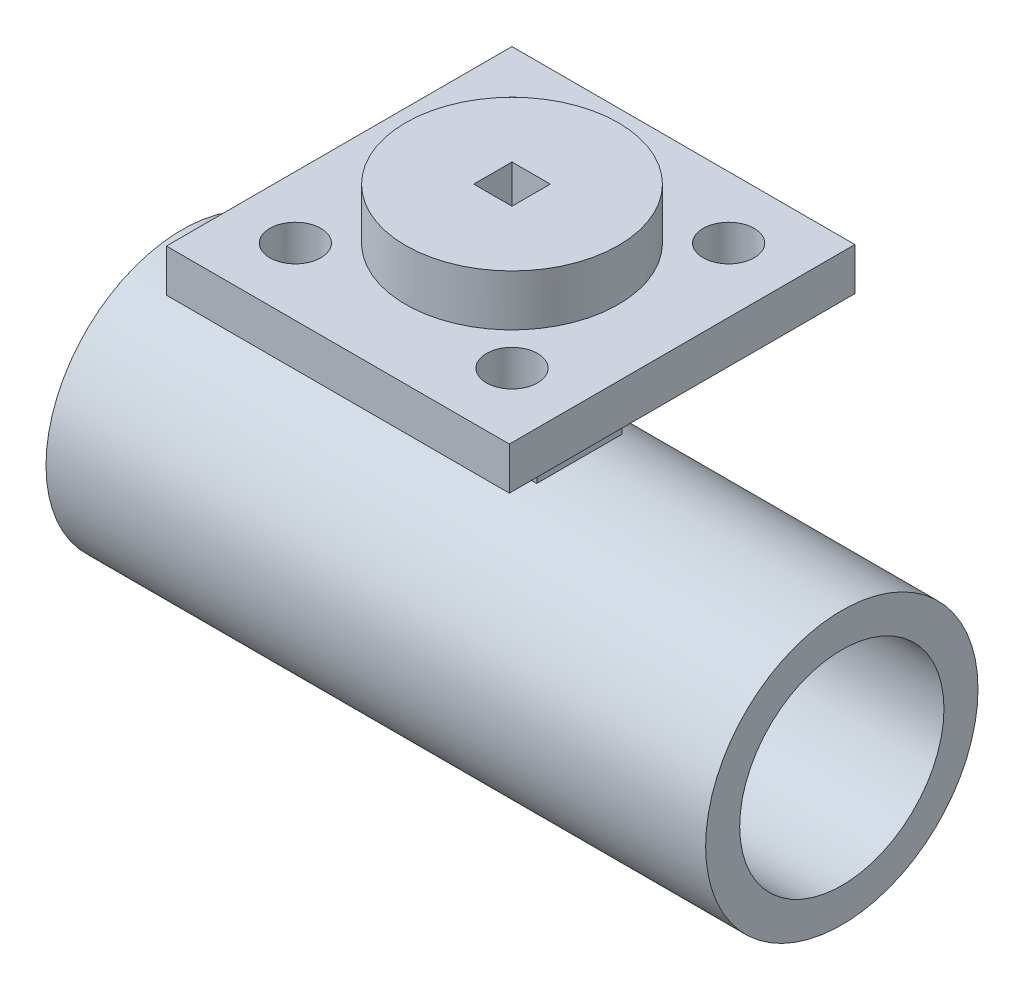
ISO-10303-21;
HEADER;
FILE_DESCRIPTION(('STEP AP214'),'2;1');
FILE_NAME('part.step','',(''),(''),'','','');
FILE_SCHEMA(('AUTOMOTIVE_DESIGN { 1 0 10303 214 1 1 1 1 }'));
ENDSEC;
DATA;
#1=APPLICATION_CONTEXT('core data for automotive mechanical design processes');
#2=APPLICATION_PROTOCOL_DEFINITION('international standard','automotive_design',2000,#1);
#3=PRODUCT_CONTEXT('',#1,'mechanical');
#4=PRODUCT('Part','Part','',(#3));
#5=PRODUCT_RELATED_PRODUCT_CATEGORY('part','',(#4));
#6=PRODUCT_DEFINITION_FORMATION('','',#4);
#7=PRODUCT_DEFINITION_CONTEXT('part definition',#1,'design');
#8=PRODUCT_DEFINITION('design','',#6,#7);
#9=PRODUCT_DEFINITION_SHAPE('','',#8);
#10=(LENGTH_UNIT() NAMED_UNIT(*) SI_UNIT(.MILLI.,.METRE.));
#11=(NAMED_UNIT(*) PLANE_ANGLE_UNIT() SI_UNIT($,.RADIAN.));
#12=(NAMED_UNIT(*) SI_UNIT($,.STERADIAN.) SOLID_ANGLE_UNIT());
#13=UNCERTAINTY_MEASURE_WITH_UNIT(LENGTH_MEASURE(1.E-05),#10,'distance_accuracy_value','');
#14=(GEOMETRIC_REPRESENTATION_CONTEXT(3) GLOBAL_UNCERTAINTY_ASSIGNED_CONTEXT((#13)) GLOBAL_UNIT_ASSIGNED_CONTEXT((#10,
#11,#12)) REPRESENTATION_CONTEXT('',''));
#15=CARTESIAN_POINT('',(0.,0.,0.));
#16=DIRECTION('',(0.,0.,1.));
#17=DIRECTION('',(1.,0.,0.));
#18=AXIS2_PLACEMENT_3D('',#15,#16,#17);
#19=CARTESIAN_POINT('',(0.,0.,0.));
#20=DIRECTION('',(-1.,0.,0.));
#21=DIRECTION('',(0.,0.,1.));
#22=AXIS2_PLACEMENT_3D('',#19,#20,#21);
#23=CYLINDRICAL_SURFACE('',#22,16.);
#24=CARTESIAN_POINT('',(77.5,0.,0.));
#25=DIRECTION('',(-1.,0.,0.));
#26=DIRECTION('',(0.,0.,1.));
#27=AXIS2_PLACEMENT_3D('',#24,#25,#26);
#28=CIRCLE('',#27,16.);
#29=CARTESIAN_POINT('',(77.5,0.,16.));
#30=VERTEX_POINT('',#29);
#31=EDGE_CURVE('E82',#30,#30,#28,.T.);
#32=ORIENTED_EDGE('',*,*,#31,.T.);
#33=EDGE_LOOP('',(#32));
#34=FACE_BOUND('',#33,.T.);
#35=CARTESIAN_POINT('',(0.,0.,0.));
#36=DIRECTION('',(-1.,0.,0.));
#37=DIRECTION('',(0.,0.,1.));
#38=AXIS2_PLACEMENT_3D('',#35,#36,#37);
#39=CIRCLE('',#38,16.);
#40=CARTESIAN_POINT('',(0.,0.,16.));
#41=VERTEX_POINT('',#40);
#42=EDGE_CURVE('E12',#41,#41,#39,.T.);
#43=ORIENTED_EDGE('',*,*,#42,.F.);
#44=EDGE_LOOP('',(#43));
#45=FACE_BOUND('',#44,.T.);
#46=ADVANCED_FACE('F68',(#34,#45),#23,.T.);
#47=CARTESIAN_POINT('',(0.,0.,0.));
#48=DIRECTION('',(-1.,0.,0.));
#49=DIRECTION('',(0.,0.,1.));
#50=AXIS2_PLACEMENT_3D('',#47,#48,#49);
#51=PLANE('',#50);
#52=ORIENTED_EDGE('',*,*,#42,.T.);
#53=EDGE_LOOP('',(#52));
#54=FACE_BOUND('',#53,.T.);
#55=CARTESIAN_POINT('',(0.,0.,0.));
#56=DIRECTION('',(-1.,0.,0.));
#57=DIRECTION('',(0.,0.,1.));
#58=AXIS2_PLACEMENT_3D('',#55,#56,#57);
#59=CIRCLE('',#58,12.);
#60=CARTESIAN_POINT('',(0.,0.,12.));
#61=VERTEX_POINT('',#60);
#62=EDGE_CURVE('E74',#61,#61,#59,.T.);
#63=ORIENTED_EDGE('',*,*,#62,.F.);
#64=EDGE_LOOP('',(#63));
#65=FACE_BOUND('',#64,.T.);
#66=ADVANCED_FACE('F98',(#54,#65),#51,.T.);
#67=CARTESIAN_POINT('',(0.,0.,0.));
#68=DIRECTION('',(-1.,0.,0.));
#69=DIRECTION('',(0.,0.,1.));
#70=AXIS2_PLACEMENT_3D('',#67,#68,#69);
#71=CYLINDRICAL_SURFACE('',#70,12.);
#72=ORIENTED_EDGE('',*,*,#62,.T.);
#73=EDGE_LOOP('',(#72));
#74=FACE_BOUND('',#73,.T.);
#75=CARTESIAN_POINT('',(77.5,0.,0.));
#76=DIRECTION('',(-1.,0.,0.));
#77=DIRECTION('',(0.,0.,1.));
#78=AXIS2_PLACEMENT_3D('',#75,#76,#77);
#79=CIRCLE('',#78,12.);
#80=CARTESIAN_POINT('',(77.5,0.,12.));
#81=VERTEX_POINT('',#80);
#82=EDGE_CURVE('E78',#81,#81,#79,.T.);
#83=ORIENTED_EDGE('',*,*,#82,.F.);
#84=EDGE_LOOP('',(#83));
#85=FACE_BOUND('',#84,.T.);
#86=ADVANCED_FACE('F92',(#74,#85),#71,.F.);
#87=CARTESIAN_POINT('',(77.5,0.,0.));
#88=DIRECTION('',(1.,0.,0.));
#89=DIRECTION('',(0.,0.,-1.));
#90=AXIS2_PLACEMENT_3D('',#87,#88,#89);
#91=PLANE('',#90);
#92=ORIENTED_EDGE('',*,*,#82,.T.);
#93=EDGE_LOOP('',(#92));
#94=FACE_BOUND('',#93,.T.);
#95=ORIENTED_EDGE('',*,*,#31,.F.);
#96=EDGE_LOOP('',(#95));
#97=FACE_BOUND('',#96,.T.);
#98=ADVANCED_FACE('F90',(#94,#97),#91,.T.);
#99=CLOSED_SHELL('',(#46,#66,#86,#98));
#100=MANIFOLD_SOLID_BREP('B2',#99);
#101=CARTESIAN_POINT('',(0.,34.,-16.));
#102=DIRECTION('',(0.,-1.,0.));
#103=DIRECTION('',(0.,0.,-1.));
#104=AXIS2_PLACEMENT_3D('',#101,#102,#103);
#105=PLANE('',#104);
#106=CARTESIAN_POINT('',(26.0220779386425,34.,12.7279220613575));
#107=DIRECTION('',(0.,1.,0.));
#108=DIRECTION('',(0.,0.,1.));
#109=AXIS2_PLACEMENT_3D('',#106,#107,#108);
#110=CIRCLE('',#109,3.);
#111=CARTESIAN_POINT('',(26.0220779386425,34.,15.7279220613575));
#112=VERTEX_POINT('',#111);
#113=EDGE_CURVE('E325',#112,#112,#110,.T.);
#114=ORIENTED_EDGE('',*,*,#113,.F.);
#115=EDGE_LOOP('',(#114));
#116=FACE_BOUND('',#115,.T.);
#117=CARTESIAN_POINT('',(51.4779220613575,34.,12.7279220613575));
#118=DIRECTION('',(0.,1.,0.));
#119=DIRECTION('',(0.,0.,1.));
#120=AXIS2_PLACEMENT_3D('',#117,#118,#119);
#121=CIRCLE('',#120,3.00000000000063);
#122=CARTESIAN_POINT('',(51.4779220613575,34.,15.7279220613582));
#123=VERTEX_POINT('',#122);
#124=EDGE_CURVE('E330',#123,#123,#121,.T.);
#125=ORIENTED_EDGE('',*,*,#124,.F.);
#126=EDGE_LOOP('',(#125));
#127=FACE_BOUND('',#126,.T.);
#128=CARTESIAN_POINT('',(51.4779220613578,34.,-12.7279220613579));
#129=DIRECTION('',(0.,1.,0.));
#130=DIRECTION('',(0.,0.,1.));
#131=AXIS2_PLACEMENT_3D('',#128,#129,#130);
#132=CIRCLE('',#131,3.);
#133=CARTESIAN_POINT('',(51.4779220613578,34.,-9.72792206135788));
#134=VERTEX_POINT('',#133);
#135=EDGE_CURVE('E326',#134,#134,#132,.T.);
#136=ORIENTED_EDGE('',*,*,#135,.F.);
#137=EDGE_LOOP('',(#136));
#138=FACE_BOUND('',#137,.T.);
#139=CARTESIAN_POINT('',(26.0220779386422,34.,-12.7279220613573));
#140=DIRECTION('',(0.,1.,0.));
#141=DIRECTION('',(0.,0.,1.));
#142=AXIS2_PLACEMENT_3D('',#139,#140,#141);
#143=CIRCLE('',#142,3.00000000000001);
#144=CARTESIAN_POINT('',(26.0220779386422,34.,-9.72792206135726));
#145=VERTEX_POINT('',#144);
#146=EDGE_CURVE('E329',#145,#145,#143,.T.);
#147=ORIENTED_EDGE('',*,*,#146,.F.);
#148=EDGE_LOOP('',(#147));
#149=FACE_BOUND('',#148,.T.);
#150=CARTESIAN_POINT('',(38.75,34.,0.));
#151=DIRECTION('',(0.,-1.,0.));
#152=DIRECTION('',(0.,0.,-1.));
#153=AXIS2_PLACEMENT_3D('',#150,#151,#152);
#154=CIRCLE('',#153,12.5);
#155=CARTESIAN_POINT('',(38.75,34.,-12.5));
#156=VERTEX_POINT('',#155);
#157=EDGE_CURVE('E66',#156,#156,#154,.F.);
#158=ORIENTED_EDGE('',*,*,#157,.F.);
#159=EDGE_LOOP('',(#158));
#160=FACE_BOUND('',#159,.T.);
#161=DIRECTION('',(1.,0.,0.));
#162=VECTOR('',#161,1.);
#163=CARTESIAN_POINT('',(0.,34.,-19.9924655357633));
#164=LINE('',#163,#162);
#165=CARTESIAN_POINT('',(18.7498603595473,34.,-19.9924655357633));
#166=VERTEX_POINT('',#165);
#167=CARTESIAN_POINT('',(59.0415615001024,34.,-19.9924655357633));
#168=VERTEX_POINT('',#167);
#169=EDGE_CURVE('E261',#166,#168,#164,.T.);
#170=ORIENTED_EDGE('',*,*,#169,.F.);
#171=DIRECTION('',(0.,0.,1.));
#172=VECTOR('',#171,1.);
#173=CARTESIAN_POINT('',(18.7498603595473,34.,0.));
#174=LINE('',#173,#172);
#175=CARTESIAN_POINT('',(18.7498603595473,34.,20.6021698920402));
#176=VERTEX_POINT('',#175);
#177=EDGE_CURVE('E237',#166,#176,#174,.T.);
#178=ORIENTED_EDGE('',*,*,#177,.T.);
#179=DIRECTION('',(1.,0.,0.));
#180=VECTOR('',#179,1.);
#181=CARTESIAN_POINT('',(0.,34.,20.6021698920402));
#182=LINE('',#181,#180);
#183=CARTESIAN_POINT('',(59.0415615001024,34.,20.6021698920402));
#184=VERTEX_POINT('',#183);
#185=EDGE_CURVE('E264',#176,#184,#182,.T.);
#186=ORIENTED_EDGE('',*,*,#185,.T.);
#187=DIRECTION('',(0.,0.,1.));
#188=VECTOR('',#187,1.);
#189=CARTESIAN_POINT('',(59.0415615001024,34.,0.));
#190=LINE('',#189,#188);
#191=EDGE_CURVE('E251',#168,#184,#190,.T.);
#192=ORIENTED_EDGE('',*,*,#191,.F.);
#193=EDGE_LOOP('',(#170,#178,#186,#192));
#194=FACE_BOUND('',#193,.T.);
#195=ADVANCED_FACE('F144',(#116,#127,#138,#149,#160,#194),#105,.F.);
#196=CARTESIAN_POINT('',(0.,29.,-16.));
#197=DIRECTION('',(0.,-1.,0.));
#198=DIRECTION('',(0.,0.,-1.));
#199=AXIS2_PLACEMENT_3D('',#196,#197,#198);
#200=PLANE('',#199);
#201=DIRECTION('',(0.,0.,1.));
#202=VECTOR('',#201,1.);
#203=CARTESIAN_POINT('',(46.6663676784371,29.,-16.));
#204=LINE('',#203,#202);
#205=CARTESIAN_POINT('',(46.6663676784371,29.,-5.));
#206=VERTEX_POINT('',#205);
#207=CARTESIAN_POINT('',(46.6663676784371,29.,5.));
#208=VERTEX_POINT('',#207);
#209=EDGE_CURVE('E152',#206,#208,#204,.T.);
#210=ORIENTED_EDGE('',*,*,#209,.F.);
#211=DIRECTION('',(1.,0.,0.));
#212=VECTOR('',#211,1.);
#213=CARTESIAN_POINT('',(46.6663676784371,29.,-5.));
#214=LINE('',#213,#212);
#215=CARTESIAN_POINT('',(30.8336323215629,29.,-5.));
#216=VERTEX_POINT('',#215);
#217=EDGE_CURVE('E279',#216,#206,#214,.T.);
#218=ORIENTED_EDGE('',*,*,#217,.F.);
#219=DIRECTION('',(0.,0.,1.));
#220=VECTOR('',#219,1.);
#221=CARTESIAN_POINT('',(30.8336323215629,29.,-16.));
#222=LINE('',#221,#220);
#223=CARTESIAN_POINT('',(30.8336323215629,29.,5.));
#224=VERTEX_POINT('',#223);
#225=EDGE_CURVE('E343',#216,#224,#222,.T.);
#226=ORIENTED_EDGE('',*,*,#225,.T.);
#227=DIRECTION('',(-1.,0.,0.));
#228=VECTOR('',#227,1.);
#229=CARTESIAN_POINT('',(30.8336323215629,29.,5.));
#230=LINE('',#229,#228);
#231=EDGE_CURVE('E290',#208,#224,#230,.T.);
#232=ORIENTED_EDGE('',*,*,#231,.F.);
#233=EDGE_LOOP('',(#210,#218,#226,#232));
#234=FACE_BOUND('',#233,.T.);
#235=CARTESIAN_POINT('',(51.4779220613575,29.,12.7279220613575));
#236=DIRECTION('',(0.,-1.,0.));
#237=DIRECTION('',(0.,0.,-1.));
#238=AXIS2_PLACEMENT_3D('',#235,#236,#237);
#239=CIRCLE('',#238,3.00000000000063);
#240=CARTESIAN_POINT('',(51.4779220613575,29.,9.7279220613569));
#241=VERTEX_POINT('',#240);
#242=EDGE_CURVE('E345',#241,#241,#239,.T.);
#243=ORIENTED_EDGE('',*,*,#242,.F.);
#244=EDGE_LOOP('',(#243));
#245=FACE_BOUND('',#244,.T.);
#246=CARTESIAN_POINT('',(51.4779220613578,29.,-12.7279220613579));
#247=DIRECTION('',(0.,-1.,0.));
#248=DIRECTION('',(0.,0.,-1.));
#249=AXIS2_PLACEMENT_3D('',#246,#247,#248);
#250=CIRCLE('',#249,3.);
#251=CARTESIAN_POINT('',(51.4779220613578,29.,-15.7279220613579));
#252=VERTEX_POINT('',#251);
#253=EDGE_CURVE('E351',#252,#252,#250,.T.);
#254=ORIENTED_EDGE('',*,*,#253,.F.);
#255=EDGE_LOOP('',(#254));
#256=FACE_BOUND('',#255,.T.);
#257=CARTESIAN_POINT('',(26.0220779386425,29.,12.7279220613575));
#258=DIRECTION('',(0.,-1.,0.));
#259=DIRECTION('',(0.,0.,-1.));
#260=AXIS2_PLACEMENT_3D('',#257,#258,#259);
#261=CIRCLE('',#260,3.);
#262=CARTESIAN_POINT('',(26.0220779386425,29.,9.72792206135754));
#263=VERTEX_POINT('',#262);
#264=EDGE_CURVE('E348',#263,#263,#261,.T.);
#265=ORIENTED_EDGE('',*,*,#264,.F.);
#266=EDGE_LOOP('',(#265));
#267=FACE_BOUND('',#266,.T.);
#268=CARTESIAN_POINT('',(26.0220779386422,29.,-12.7279220613573));
#269=DIRECTION('',(0.,-1.,0.));
#270=DIRECTION('',(0.,0.,-1.));
#271=AXIS2_PLACEMENT_3D('',#268,#269,#270);
#272=CIRCLE('',#271,3.00000000000001);
#273=CARTESIAN_POINT('',(26.0220779386422,29.,-15.7279220613573));
#274=VERTEX_POINT('',#273);
#275=EDGE_CURVE('E337',#274,#274,#272,.T.);
#276=ORIENTED_EDGE('',*,*,#275,.F.);
#277=EDGE_LOOP('',(#276));
#278=FACE_BOUND('',#277,.T.);
#279=DIRECTION('',(1.,0.,0.));
#280=VECTOR('',#279,1.);
#281=CARTESIAN_POINT('',(0.,29.,-19.9924655357633));
#282=LINE('',#281,#280);
#283=CARTESIAN_POINT('',(18.7498603595473,29.,-19.9924655357633));
#284=VERTEX_POINT('',#283);
#285=CARTESIAN_POINT('',(59.0415615001024,29.,-19.9924655357633));
#286=VERTEX_POINT('',#285);
#287=EDGE_CURVE('E246',#284,#286,#282,.T.);
#288=ORIENTED_EDGE('',*,*,#287,.T.);
#289=DIRECTION('',(0.,0.,1.));
#290=VECTOR('',#289,1.);
#291=CARTESIAN_POINT('',(59.0415615001024,29.,0.));
#292=LINE('',#291,#290);
#293=CARTESIAN_POINT('',(59.0415615001024,29.,20.6021698920402));
#294=VERTEX_POINT('',#293);
#295=EDGE_CURVE('E242',#286,#294,#292,.T.);
#296=ORIENTED_EDGE('',*,*,#295,.T.);
#297=DIRECTION('',(1.,0.,0.));
#298=VECTOR('',#297,1.);
#299=CARTESIAN_POINT('',(0.,29.,20.6021698920402));
#300=LINE('',#299,#298);
#301=CARTESIAN_POINT('',(18.7498603595473,29.,20.6021698920402));
#302=VERTEX_POINT('',#301);
#303=EDGE_CURVE('E256',#302,#294,#300,.T.);
#304=ORIENTED_EDGE('',*,*,#303,.F.);
#305=DIRECTION('',(0.,0.,1.));
#306=VECTOR('',#305,1.);
#307=CARTESIAN_POINT('',(18.7498603595473,29.,0.));
#308=LINE('',#307,#306);
#309=EDGE_CURVE('E235',#284,#302,#308,.T.);
#310=ORIENTED_EDGE('',*,*,#309,.F.);
#311=EDGE_LOOP('',(#288,#296,#304,#310));
#312=FACE_BOUND('',#311,.T.);
#313=ADVANCED_FACE('F254',(#234,#245,#256,#267,#278,#312),#200,.T.);
#314=CARTESIAN_POINT('',(46.6663676784371,0.,-16.));
#315=DIRECTION('',(-1.,0.,0.));
#316=DIRECTION('',(0.,0.,1.));
#317=AXIS2_PLACEMENT_3D('',#314,#315,#316);
#318=PLANE('',#317);
#319=DIRECTION('',(0.,0.,1.));
#320=VECTOR('',#319,1.);
#321=CARTESIAN_POINT('',(46.6663676784371,16.,-16.));
#322=LINE('',#321,#320);
#323=CARTESIAN_POINT('',(46.6663676784371,16.,-5.));
#324=VERTEX_POINT('',#323);
#325=CARTESIAN_POINT('',(46.6663676784371,16.,5.));
#326=VERTEX_POINT('',#325);
#327=EDGE_CURVE('E339',#324,#326,#322,.T.);
#328=ORIENTED_EDGE('',*,*,#327,.F.);
#329=DIRECTION('',(0.,-1.,0.));
#330=VECTOR('',#329,1.);
#331=CARTESIAN_POINT('',(46.6663676784371,16.,-5.));
#332=LINE('',#331,#330);
#333=EDGE_CURVE('E270',#206,#324,#332,.T.);
#334=ORIENTED_EDGE('',*,*,#333,.F.);
#335=ORIENTED_EDGE('',*,*,#209,.T.);
#336=DIRECTION('',(0.,1.,0.));
#337=VECTOR('',#336,1.);
#338=CARTESIAN_POINT('',(46.6663676784371,16.,5.));
#339=LINE('',#338,#337);
#340=EDGE_CURVE('E287',#326,#208,#339,.T.);
#341=ORIENTED_EDGE('',*,*,#340,.F.);
#342=EDGE_LOOP('',(#328,#334,#335,#341));
#343=FACE_BOUND('',#342,.T.);
#344=ADVANCED_FACE('F361',(#343),#318,.F.);
#345=CARTESIAN_POINT('',(0.,16.,-16.));
#346=DIRECTION('',(0.,-1.,0.));
#347=DIRECTION('',(0.,0.,-1.));
#348=AXIS2_PLACEMENT_3D('',#345,#346,#347);
#349=PLANE('',#348);
#350=DIRECTION('',(-1.,0.,0.));
#351=VECTOR('',#350,1.);
#352=CARTESIAN_POINT('',(46.6663676784371,16.,-5.));
#353=LINE('',#352,#351);
#354=CARTESIAN_POINT('',(30.8336323215629,16.,-5.));
#355=VERTEX_POINT('',#354);
#356=EDGE_CURVE('E275',#324,#355,#353,.T.);
#357=ORIENTED_EDGE('',*,*,#356,.F.);
#358=ORIENTED_EDGE('',*,*,#327,.T.);
#359=DIRECTION('',(1.,0.,0.));
#360=VECTOR('',#359,1.);
#361=CARTESIAN_POINT('',(30.8336323215629,16.,5.));
#362=LINE('',#361,#360);
#363=CARTESIAN_POINT('',(30.8336323215629,16.,5.));
#364=VERTEX_POINT('',#363);
#365=EDGE_CURVE('E284',#364,#326,#362,.T.);
#366=ORIENTED_EDGE('',*,*,#365,.F.);
#367=DIRECTION('',(0.,0.,1.));
#368=VECTOR('',#367,1.);
#369=CARTESIAN_POINT('',(30.8336323215629,16.,-16.));
#370=LINE('',#369,#368);
#371=EDGE_CURVE('E341',#355,#364,#370,.T.);
#372=ORIENTED_EDGE('',*,*,#371,.F.);
#373=EDGE_LOOP('',(#357,#358,#366,#372));
#374=FACE_BOUND('',#373,.T.);
#375=ADVANCED_FACE('F443',(#374),#349,.T.);
#376=CARTESIAN_POINT('',(30.8336323215629,0.,-16.));
#377=DIRECTION('',(-1.,0.,0.));
#378=DIRECTION('',(0.,0.,1.));
#379=AXIS2_PLACEMENT_3D('',#376,#377,#378);
#380=PLANE('',#379);
#381=DIRECTION('',(0.,1.,0.));
#382=VECTOR('',#381,1.);
#383=CARTESIAN_POINT('',(30.8336323215629,16.,-5.));
#384=LINE('',#383,#382);
#385=EDGE_CURVE('E277',#355,#216,#384,.T.);
#386=ORIENTED_EDGE('',*,*,#385,.F.);
#387=ORIENTED_EDGE('',*,*,#371,.T.);
#388=DIRECTION('',(0.,-1.,0.));
#389=VECTOR('',#388,1.);
#390=CARTESIAN_POINT('',(30.8336323215629,16.,5.));
#391=LINE('',#390,#389);
#392=EDGE_CURVE('E281',#224,#364,#391,.T.);
#393=ORIENTED_EDGE('',*,*,#392,.F.);
#394=ORIENTED_EDGE('',*,*,#225,.F.);
#395=EDGE_LOOP('',(#386,#387,#393,#394));
#396=FACE_BOUND('',#395,.T.);
#397=ADVANCED_FACE('F374',(#396),#380,.T.);
#398=CARTESIAN_POINT('',(26.0220779386422,19.,-12.7279220613573));
#399=DIRECTION('',(0.,1.,0.));
#400=DIRECTION('',(0.,0.,1.));
#401=AXIS2_PLACEMENT_3D('',#398,#399,#400);
#402=CYLINDRICAL_SURFACE('',#401,3.00000000000001);
#403=ORIENTED_EDGE('',*,*,#275,.T.);
#404=EDGE_LOOP('',(#403));
#405=FACE_BOUND('',#404,.T.);
#406=ORIENTED_EDGE('',*,*,#146,.T.);
#407=EDGE_LOOP('',(#406));
#408=FACE_BOUND('',#407,.T.);
#409=ADVANCED_FACE('F370',(#405,#408),#402,.F.);
#410=CARTESIAN_POINT('',(26.0220779386425,19.,12.7279220613575));
#411=DIRECTION('',(0.,1.,0.));
#412=DIRECTION('',(0.,0.,1.));
#413=AXIS2_PLACEMENT_3D('',#410,#411,#412);
#414=CYLINDRICAL_SURFACE('',#413,3.);
#415=ORIENTED_EDGE('',*,*,#264,.T.);
#416=EDGE_LOOP('',(#415));
#417=FACE_BOUND('',#416,.T.);
#418=ORIENTED_EDGE('',*,*,#113,.T.);
#419=EDGE_LOOP('',(#418));
#420=FACE_BOUND('',#419,.T.);
#421=ADVANCED_FACE('F373',(#417,#420),#414,.F.);
#422=CARTESIAN_POINT('',(51.4779220613578,19.,-12.7279220613579));
#423=DIRECTION('',(0.,1.,0.));
#424=DIRECTION('',(0.,0.,1.));
#425=AXIS2_PLACEMENT_3D('',#422,#423,#424);
#426=CYLINDRICAL_SURFACE('',#425,3.);
#427=ORIENTED_EDGE('',*,*,#253,.T.);
#428=EDGE_LOOP('',(#427));
#429=FACE_BOUND('',#428,.T.);
#430=ORIENTED_EDGE('',*,*,#135,.T.);
#431=EDGE_LOOP('',(#430));
#432=FACE_BOUND('',#431,.T.);
#433=ADVANCED_FACE('F432',(#429,#432),#426,.F.);
#434=CARTESIAN_POINT('',(51.4779220613575,19.,12.7279220613575));
#435=DIRECTION('',(0.,1.,0.));
#436=DIRECTION('',(0.,0.,1.));
#437=AXIS2_PLACEMENT_3D('',#434,#435,#436);
#438=CYLINDRICAL_SURFACE('',#437,3.00000000000063);
#439=ORIENTED_EDGE('',*,*,#242,.T.);
#440=EDGE_LOOP('',(#439));
#441=FACE_BOUND('',#440,.T.);
#442=ORIENTED_EDGE('',*,*,#124,.T.);
#443=EDGE_LOOP('',(#442));
#444=FACE_BOUND('',#443,.T.);
#445=ADVANCED_FACE('F356',(#441,#444),#438,.F.);
#446=CARTESIAN_POINT('',(38.75,40.,0.));
#447=DIRECTION('',(0.,1.,0.));
#448=DIRECTION('',(0.,0.,1.));
#449=AXIS2_PLACEMENT_3D('',#446,#447,#448);
#450=PLANE('',#449);
#451=CARTESIAN_POINT('',(38.75,40.,0.));
#452=DIRECTION('',(0.,1.,0.));
#453=DIRECTION('',(0.,0.,1.));
#454=AXIS2_PLACEMENT_3D('',#451,#452,#453);
#455=CIRCLE('',#454,12.5);
#456=CARTESIAN_POINT('',(38.75,40.,12.5));
#457=VERTEX_POINT('',#456);
#458=EDGE_CURVE('E322',#457,#457,#455,.T.);
#459=ORIENTED_EDGE('',*,*,#458,.T.);
#460=EDGE_LOOP('',(#459));
#461=FACE_BOUND('',#460,.T.);
#462=DIRECTION('',(0.,0.,-1.));
#463=VECTOR('',#462,1.);
#464=CARTESIAN_POINT('',(40.9999786860371,40.,0.));
#465=LINE('',#464,#463);
#466=CARTESIAN_POINT('',(40.9999786860371,40.,2.24974318525875));
#467=VERTEX_POINT('',#466);
#468=CARTESIAN_POINT('',(40.9999786860371,40.,-2.24974318525875));
#469=VERTEX_POINT('',#468);
#470=EDGE_CURVE('E295',#467,#469,#465,.T.);
#471=ORIENTED_EDGE('',*,*,#470,.F.);
#472=DIRECTION('',(1.,0.,0.));
#473=VECTOR('',#472,1.);
#474=CARTESIAN_POINT('',(0.,40.,2.24974318525875));
#475=LINE('',#474,#473);
#476=CARTESIAN_POINT('',(36.5000213139629,40.,2.24974318525875));
#477=VERTEX_POINT('',#476);
#478=EDGE_CURVE('E293',#477,#467,#475,.T.);
#479=ORIENTED_EDGE('',*,*,#478,.F.);
#480=DIRECTION('',(0.,0.,-1.));
#481=VECTOR('',#480,1.);
#482=CARTESIAN_POINT('',(36.5000213139629,40.,0.));
#483=LINE('',#482,#481);
#484=CARTESIAN_POINT('',(36.5000213139629,40.,-2.24974318525875));
#485=VERTEX_POINT('',#484);
#486=EDGE_CURVE('E301',#477,#485,#483,.T.);
#487=ORIENTED_EDGE('',*,*,#486,.T.);
#488=DIRECTION('',(1.,0.,0.));
#489=VECTOR('',#488,1.);
#490=CARTESIAN_POINT('',(0.,40.,-2.24974318525875));
#491=LINE('',#490,#489);
#492=EDGE_CURVE('E298',#485,#469,#491,.T.);
#493=ORIENTED_EDGE('',*,*,#492,.T.);
#494=EDGE_LOOP('',(#471,#479,#487,#493));
#495=FACE_BOUND('',#494,.T.);
#496=ADVANCED_FACE('F425',(#461,#495),#450,.T.);
#497=CARTESIAN_POINT('',(38.75,40.,0.));
#498=DIRECTION('',(0.,-1.,0.));
#499=DIRECTION('',(0.,0.,-1.));
#500=AXIS2_PLACEMENT_3D('',#497,#498,#499);
#501=CYLINDRICAL_SURFACE('',#500,12.5);
#502=ORIENTED_EDGE('',*,*,#458,.F.);
#503=EDGE_LOOP('',(#502));
#504=FACE_BOUND('',#503,.T.);
#505=ORIENTED_EDGE('',*,*,#157,.T.);
#506=EDGE_LOOP('',(#505));
#507=FACE_BOUND('',#506,.T.);
#508=ADVANCED_FACE('F423',(#504,#507),#501,.T.);
#509=CARTESIAN_POINT('',(0.,40.,2.24974318525875));
#510=DIRECTION('',(0.,0.,-1.));
#511=DIRECTION('',(-1.,0.,0.));
#512=AXIS2_PLACEMENT_3D('',#509,#510,#511);
#513=PLANE('',#512);
#514=DIRECTION('',(1.,0.,0.));
#515=VECTOR('',#514,1.);
#516=CARTESIAN_POINT('',(0.,34.,2.24974318525875));
#517=LINE('',#516,#515);
#518=CARTESIAN_POINT('',(36.5000213139629,34.,2.24974318525875));
#519=VERTEX_POINT('',#518);
#520=CARTESIAN_POINT('',(40.9999786860371,34.,2.24974318525875));
#521=VERTEX_POINT('',#520);
#522=EDGE_CURVE('E159',#519,#521,#517,.T.);
#523=ORIENTED_EDGE('',*,*,#522,.F.);
#524=DIRECTION('',(0.,-1.,0.));
#525=VECTOR('',#524,1.);
#526=CARTESIAN_POINT('',(36.5000213139629,40.,2.24974318525875));
#527=LINE('',#526,#525);
#528=EDGE_CURVE('E304',#477,#519,#527,.T.);
#529=ORIENTED_EDGE('',*,*,#528,.F.);
#530=ORIENTED_EDGE('',*,*,#478,.T.);
#531=DIRECTION('',(0.,-1.,0.));
#532=VECTOR('',#531,1.);
#533=CARTESIAN_POINT('',(40.9999786860371,40.,2.24974318525875));
#534=LINE('',#533,#532);
#535=EDGE_CURVE('E319',#467,#521,#534,.T.);
#536=ORIENTED_EDGE('',*,*,#535,.T.);
#537=EDGE_LOOP('',(#523,#529,#530,#536));
#538=FACE_BOUND('',#537,.T.);
#539=ADVANCED_FACE('F419',(#538),#513,.T.);
#540=CARTESIAN_POINT('',(40.9999786860371,40.,0.));
#541=DIRECTION('',(-1.,0.,0.));
#542=DIRECTION('',(0.,0.,1.));
#543=AXIS2_PLACEMENT_3D('',#540,#541,#542);
#544=PLANE('',#543);
#545=DIRECTION('',(0.,0.,-1.));
#546=VECTOR('',#545,1.);
#547=CARTESIAN_POINT('',(40.9999786860371,34.,0.));
#548=LINE('',#547,#546);
#549=CARTESIAN_POINT('',(40.9999786860371,34.,-2.24974318525875));
#550=VERTEX_POINT('',#549);
#551=EDGE_CURVE('E163',#521,#550,#548,.T.);
#552=ORIENTED_EDGE('',*,*,#551,.F.);
#553=ORIENTED_EDGE('',*,*,#535,.F.);
#554=ORIENTED_EDGE('',*,*,#470,.T.);
#555=DIRECTION('',(0.,-1.,0.));
#556=VECTOR('',#555,1.);
#557=CARTESIAN_POINT('',(40.9999786860371,40.,-2.24974318525875));
#558=LINE('',#557,#556);
#559=EDGE_CURVE('E317',#469,#550,#558,.T.);
#560=ORIENTED_EDGE('',*,*,#559,.T.);
#561=EDGE_LOOP('',(#552,#553,#554,#560));
#562=FACE_BOUND('',#561,.T.);
#563=ADVANCED_FACE('F415',(#562),#544,.T.);
#564=CARTESIAN_POINT('',(0.,40.,-2.24974318525875));
#565=DIRECTION('',(0.,0.,-1.));
#566=DIRECTION('',(-1.,0.,0.));
#567=AXIS2_PLACEMENT_3D('',#564,#565,#566);
#568=PLANE('',#567);
#569=DIRECTION('',(1.,0.,0.));
#570=VECTOR('',#569,1.);
#571=CARTESIAN_POINT('',(0.,34.,-2.24974318525875));
#572=LINE('',#571,#570);
#573=CARTESIAN_POINT('',(36.5000213139629,34.,-2.24974318525875));
#574=VERTEX_POINT('',#573);
#575=EDGE_CURVE('E307',#574,#550,#572,.T.);
#576=ORIENTED_EDGE('',*,*,#575,.T.);
#577=ORIENTED_EDGE('',*,*,#559,.F.);
#578=ORIENTED_EDGE('',*,*,#492,.F.);
#579=DIRECTION('',(0.,-1.,0.));
#580=VECTOR('',#579,1.);
#581=CARTESIAN_POINT('',(36.5000213139629,40.,-2.24974318525875));
#582=LINE('',#581,#580);
#583=EDGE_CURVE('E314',#485,#574,#582,.T.);
#584=ORIENTED_EDGE('',*,*,#583,.T.);
#585=EDGE_LOOP('',(#576,#577,#578,#584));
#586=FACE_BOUND('',#585,.T.);
#587=ADVANCED_FACE('F411',(#586),#568,.F.);
#588=CARTESIAN_POINT('',(36.5000213139629,40.,0.));
#589=DIRECTION('',(-1.,0.,0.));
#590=DIRECTION('',(0.,0.,1.));
#591=AXIS2_PLACEMENT_3D('',#588,#589,#590);
#592=PLANE('',#591);
#593=DIRECTION('',(0.,0.,-1.));
#594=VECTOR('',#593,1.);
#595=CARTESIAN_POINT('',(36.5000213139629,34.,0.));
#596=LINE('',#595,#594);
#597=EDGE_CURVE('E296',#519,#574,#596,.T.);
#598=ORIENTED_EDGE('',*,*,#597,.T.);
#599=ORIENTED_EDGE('',*,*,#583,.F.);
#600=ORIENTED_EDGE('',*,*,#486,.F.);
#601=ORIENTED_EDGE('',*,*,#528,.T.);
#602=EDGE_LOOP('',(#598,#599,#600,#601));
#603=FACE_BOUND('',#602,.T.);
#604=ADVANCED_FACE('F408',(#603),#592,.F.);
#605=ORIENTED_EDGE('',*,*,#597,.F.);
#606=ORIENTED_EDGE('',*,*,#522,.T.);
#607=ORIENTED_EDGE('',*,*,#551,.T.);
#608=ORIENTED_EDGE('',*,*,#575,.F.);
#609=EDGE_LOOP('',(#605,#606,#607,#608));
#610=FACE_BOUND('',#609,.T.);
#611=ADVANCED_FACE('F146',(#610),#105,.F.);
#612=CARTESIAN_POINT('',(0.,0.,5.));
#613=DIRECTION('',(0.,0.,-1.));
#614=DIRECTION('',(-1.,0.,0.));
#615=AXIS2_PLACEMENT_3D('',#612,#613,#614);
#616=PLANE('',#615);
#617=ORIENTED_EDGE('',*,*,#392,.T.);
#618=ORIENTED_EDGE('',*,*,#365,.T.);
#619=ORIENTED_EDGE('',*,*,#340,.T.);
#620=ORIENTED_EDGE('',*,*,#231,.T.);
#621=EDGE_LOOP('',(#617,#618,#619,#620));
#622=FACE_BOUND('',#621,.T.);
#623=ADVANCED_FACE('F403',(#622),#616,.F.);
#624=CARTESIAN_POINT('',(0.,0.,-5.));
#625=DIRECTION('',(0.,0.,1.));
#626=DIRECTION('',(1.,0.,0.));
#627=AXIS2_PLACEMENT_3D('',#624,#625,#626);
#628=PLANE('',#627);
#629=ORIENTED_EDGE('',*,*,#333,.T.);
#630=ORIENTED_EDGE('',*,*,#356,.T.);
#631=ORIENTED_EDGE('',*,*,#385,.T.);
#632=ORIENTED_EDGE('',*,*,#217,.T.);
#633=EDGE_LOOP('',(#629,#630,#631,#632));
#634=FACE_BOUND('',#633,.T.);
#635=ADVANCED_FACE('F400',(#634),#628,.F.);
#636=CARTESIAN_POINT('',(0.,29.,-19.9924655357633));
#637=DIRECTION('',(0.,0.,1.));
#638=DIRECTION('',(1.,0.,0.));
#639=AXIS2_PLACEMENT_3D('',#636,#637,#638);
#640=PLANE('',#639);
#641=ORIENTED_EDGE('',*,*,#169,.T.);
#642=DIRECTION('',(0.,1.,0.));
#643=VECTOR('',#642,1.);
#644=CARTESIAN_POINT('',(59.0415615001024,29.,-19.9924655357633));
#645=LINE('',#644,#643);
#646=EDGE_CURVE('E249',#286,#168,#645,.T.);
#647=ORIENTED_EDGE('',*,*,#646,.F.);
#648=ORIENTED_EDGE('',*,*,#287,.F.);
#649=DIRECTION('',(0.,1.,0.));
#650=VECTOR('',#649,1.);
#651=CARTESIAN_POINT('',(18.7498603595473,29.,-19.9924655357633));
#652=LINE('',#651,#650);
#653=EDGE_CURVE('E231',#284,#166,#652,.T.);
#654=ORIENTED_EDGE('',*,*,#653,.T.);
#655=EDGE_LOOP('',(#641,#647,#648,#654));
#656=FACE_BOUND('',#655,.T.);
#657=ADVANCED_FACE('F247',(#656),#640,.F.);
#658=CARTESIAN_POINT('',(59.0415615001024,29.,0.));
#659=DIRECTION('',(-1.,0.,0.));
#660=DIRECTION('',(0.,0.,1.));
#661=AXIS2_PLACEMENT_3D('',#658,#659,#660);
#662=PLANE('',#661);
#663=ORIENTED_EDGE('',*,*,#191,.T.);
#664=DIRECTION('',(0.,1.,0.));
#665=VECTOR('',#664,1.);
#666=CARTESIAN_POINT('',(59.0415615001024,29.,20.6021698920402));
#667=LINE('',#666,#665);
#668=EDGE_CURVE('E271',#294,#184,#667,.T.);
#669=ORIENTED_EDGE('',*,*,#668,.F.);
#670=ORIENTED_EDGE('',*,*,#295,.F.);
#671=ORIENTED_EDGE('',*,*,#646,.T.);
#672=EDGE_LOOP('',(#663,#669,#670,#671));
#673=FACE_BOUND('',#672,.T.);
#674=ADVANCED_FACE('F386',(#673),#662,.F.);
#675=CARTESIAN_POINT('',(0.,29.,20.6021698920402));
#676=DIRECTION('',(0.,0.,1.));
#677=DIRECTION('',(1.,0.,0.));
#678=AXIS2_PLACEMENT_3D('',#675,#676,#677);
#679=PLANE('',#678);
#680=ORIENTED_EDGE('',*,*,#185,.F.);
#681=DIRECTION('',(0.,1.,0.));
#682=VECTOR('',#681,1.);
#683=CARTESIAN_POINT('',(18.7498603595473,29.,20.6021698920402));
#684=LINE('',#683,#682);
#685=EDGE_CURVE('E241',#302,#176,#684,.T.);
#686=ORIENTED_EDGE('',*,*,#685,.F.);
#687=ORIENTED_EDGE('',*,*,#303,.T.);
#688=ORIENTED_EDGE('',*,*,#668,.T.);
#689=EDGE_LOOP('',(#680,#686,#687,#688));
#690=FACE_BOUND('',#689,.T.);
#691=ADVANCED_FACE('F388',(#690),#679,.T.);
#692=CARTESIAN_POINT('',(18.7498603595473,29.,0.));
#693=DIRECTION('',(-1.,0.,0.));
#694=DIRECTION('',(0.,0.,1.));
#695=AXIS2_PLACEMENT_3D('',#692,#693,#694);
#696=PLANE('',#695);
#697=ORIENTED_EDGE('',*,*,#177,.F.);
#698=ORIENTED_EDGE('',*,*,#653,.F.);
#699=ORIENTED_EDGE('',*,*,#309,.T.);
#700=ORIENTED_EDGE('',*,*,#685,.T.);
#701=EDGE_LOOP('',(#697,#698,#699,#700));
#702=FACE_BOUND('',#701,.T.);
#703=ADVANCED_FACE('F233',(#702),#696,.T.);
#704=CLOSED_SHELL('',(#195,#313,#344,#375,#397,#409,#421,#433,#445,#496,#508,#539,#563,#587,
#604,#611,#623,#635,#657,#674,#691,#703));
#705=MANIFOLD_SOLID_BREP('B7',#704);
#706=ADVANCED_BREP_SHAPE_REPRESENTATION('',(#18,#100,#705),#14);
#707=SHAPE_DEFINITION_REPRESENTATION(#9,#706);
ENDSEC;
END-ISO-10303-21;
